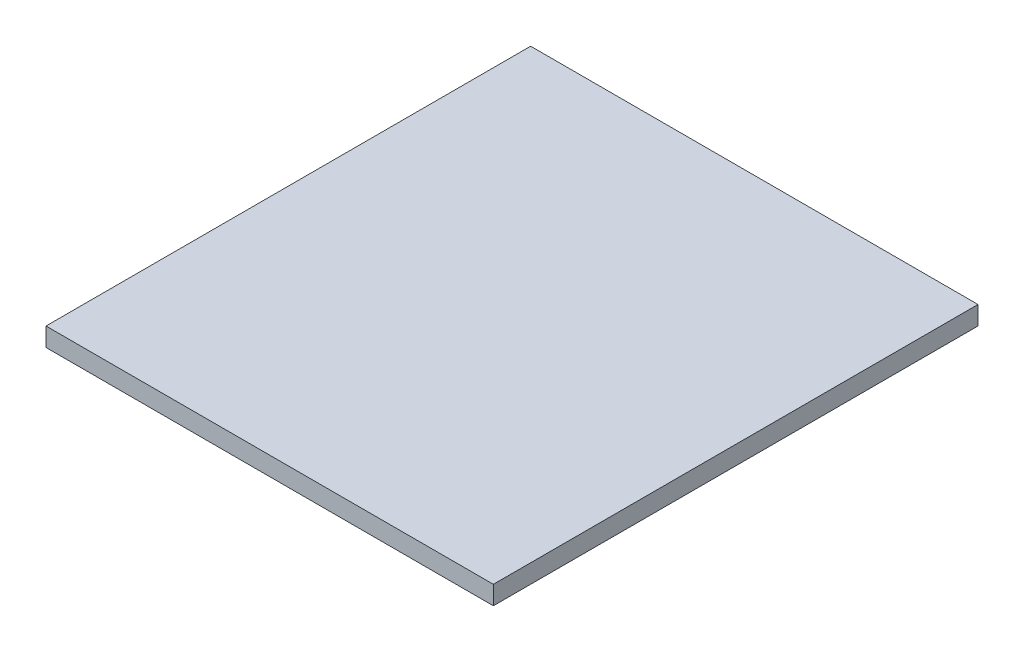
ISO-10303-21;
HEADER;
FILE_DESCRIPTION(('STEP AP214'),'2;1');
FILE_NAME('part.step','',(''),(''),'','','');
FILE_SCHEMA(('AUTOMOTIVE_DESIGN { 1 0 10303 214 1 1 1 1 }'));
ENDSEC;
DATA;
#1=APPLICATION_CONTEXT('core data for automotive mechanical design processes');
#2=APPLICATION_PROTOCOL_DEFINITION('international standard','automotive_design',2000,#1);
#3=PRODUCT_CONTEXT('',#1,'mechanical');
#4=PRODUCT('Part','Part','',(#3));
#5=PRODUCT_RELATED_PRODUCT_CATEGORY('part','',(#4));
#6=PRODUCT_DEFINITION_FORMATION('','',#4);
#7=PRODUCT_DEFINITION_CONTEXT('part definition',#1,'design');
#8=PRODUCT_DEFINITION('design','',#6,#7);
#9=PRODUCT_DEFINITION_SHAPE('','',#8);
#10=(LENGTH_UNIT() NAMED_UNIT(*) SI_UNIT(.MILLI.,.METRE.));
#11=(NAMED_UNIT(*) PLANE_ANGLE_UNIT() SI_UNIT($,.RADIAN.));
#12=(NAMED_UNIT(*) SI_UNIT($,.STERADIAN.) SOLID_ANGLE_UNIT());
#13=UNCERTAINTY_MEASURE_WITH_UNIT(LENGTH_MEASURE(1.E-05),#10,'distance_accuracy_value','');
#14=(GEOMETRIC_REPRESENTATION_CONTEXT(3) GLOBAL_UNCERTAINTY_ASSIGNED_CONTEXT((#13)) GLOBAL_UNIT_ASSIGNED_CONTEXT((#10,
#11,#12)) REPRESENTATION_CONTEXT('',''));
#15=CARTESIAN_POINT('',(0.,0.,0.));
#16=DIRECTION('',(0.,0.,1.));
#17=DIRECTION('',(1.,0.,0.));
#18=AXIS2_PLACEMENT_3D('',#15,#16,#17);
#19=CARTESIAN_POINT('',(114.3,9.525,-123.825));
#20=DIRECTION('',(-1.,0.,0.));
#21=DIRECTION('',(0.,0.,1.));
#22=AXIS2_PLACEMENT_3D('',#19,#20,#21);
#23=PLANE('',#22);
#24=DIRECTION('',(0.,0.,-1.));
#25=VECTOR('',#24,1.);
#26=CARTESIAN_POINT('',(114.3,0.,-123.825));
#27=LINE('',#26,#25);
#28=CARTESIAN_POINT('',(114.3,0.,123.825));
#29=VERTEX_POINT('',#28);
#30=CARTESIAN_POINT('',(114.3,0.,-123.825));
#31=VERTEX_POINT('',#30);
#32=EDGE_CURVE('E111',#29,#31,#27,.T.);
#33=ORIENTED_EDGE('',*,*,#32,.T.);
#34=DIRECTION('',(0.,-1.,0.));
#35=VECTOR('',#34,1.);
#36=CARTESIAN_POINT('',(114.3,9.525,-123.825));
#37=LINE('',#36,#35);
#38=CARTESIAN_POINT('',(114.3,9.525,-123.825));
#39=VERTEX_POINT('',#38);
#40=EDGE_CURVE('E11',#39,#31,#37,.T.);
#41=ORIENTED_EDGE('',*,*,#40,.F.);
#42=DIRECTION('',(0.,0.,-1.));
#43=VECTOR('',#42,1.);
#44=CARTESIAN_POINT('',(114.3,9.525,-123.825));
#45=LINE('',#44,#43);
#46=CARTESIAN_POINT('',(114.3,9.525,123.825));
#47=VERTEX_POINT('',#46);
#48=EDGE_CURVE('E95',#47,#39,#45,.T.);
#49=ORIENTED_EDGE('',*,*,#48,.F.);
#50=DIRECTION('',(0.,-1.,0.));
#51=VECTOR('',#50,1.);
#52=CARTESIAN_POINT('',(114.3,9.525,123.825));
#53=LINE('',#52,#51);
#54=EDGE_CURVE('E107',#47,#29,#53,.T.);
#55=ORIENTED_EDGE('',*,*,#54,.T.);
#56=EDGE_LOOP('',(#33,#41,#49,#55));
#57=FACE_BOUND('',#56,.T.);
#58=ADVANCED_FACE('F43',(#57),#23,.F.);
#59=CARTESIAN_POINT('',(-114.3,9.525,-123.825));
#60=DIRECTION('',(0.,0.,1.));
#61=DIRECTION('',(1.,0.,0.));
#62=AXIS2_PLACEMENT_3D('',#59,#60,#61);
#63=PLANE('',#62);
#64=DIRECTION('',(-1.,0.,0.));
#65=VECTOR('',#64,1.);
#66=CARTESIAN_POINT('',(-114.3,0.,-123.825));
#67=LINE('',#66,#65);
#68=CARTESIAN_POINT('',(-114.3,0.,-123.825));
#69=VERTEX_POINT('',#68);
#70=EDGE_CURVE('E100',#31,#69,#67,.T.);
#71=ORIENTED_EDGE('',*,*,#70,.T.);
#72=DIRECTION('',(0.,-1.,0.));
#73=VECTOR('',#72,1.);
#74=CARTESIAN_POINT('',(-114.3,9.525,-123.825));
#75=LINE('',#74,#73);
#76=CARTESIAN_POINT('',(-114.3,9.525,-123.825));
#77=VERTEX_POINT('',#76);
#78=EDGE_CURVE('E52',#77,#69,#75,.T.);
#79=ORIENTED_EDGE('',*,*,#78,.F.);
#80=DIRECTION('',(-1.,0.,0.));
#81=VECTOR('',#80,1.);
#82=CARTESIAN_POINT('',(-114.3,9.525,-123.825));
#83=LINE('',#82,#81);
#84=EDGE_CURVE('E90',#39,#77,#83,.T.);
#85=ORIENTED_EDGE('',*,*,#84,.F.);
#86=ORIENTED_EDGE('',*,*,#40,.T.);
#87=EDGE_LOOP('',(#71,#79,#85,#86));
#88=FACE_BOUND('',#87,.T.);
#89=ADVANCED_FACE('F99',(#88),#63,.F.);
#90=CARTESIAN_POINT('',(-114.3,9.525,-123.825));
#91=DIRECTION('',(1.,0.,0.));
#92=DIRECTION('',(0.,0.,-1.));
#93=AXIS2_PLACEMENT_3D('',#90,#91,#92);
#94=PLANE('',#93);
#95=DIRECTION('',(0.,0.,1.));
#96=VECTOR('',#95,1.);
#97=CARTESIAN_POINT('',(-114.3,0.,-123.825));
#98=LINE('',#97,#96);
#99=CARTESIAN_POINT('',(-114.3,0.,123.825));
#100=VERTEX_POINT('',#99);
#101=EDGE_CURVE('E77',#69,#100,#98,.T.);
#102=ORIENTED_EDGE('',*,*,#101,.T.);
#103=DIRECTION('',(0.,-1.,0.));
#104=VECTOR('',#103,1.);
#105=CARTESIAN_POINT('',(-114.3,9.525,123.825));
#106=LINE('',#105,#104);
#107=CARTESIAN_POINT('',(-114.3,9.525,123.825));
#108=VERTEX_POINT('',#107);
#109=EDGE_CURVE('E102',#108,#100,#106,.T.);
#110=ORIENTED_EDGE('',*,*,#109,.F.);
#111=DIRECTION('',(0.,0.,1.));
#112=VECTOR('',#111,1.);
#113=CARTESIAN_POINT('',(-114.3,9.525,-123.825));
#114=LINE('',#113,#112);
#115=EDGE_CURVE('E93',#77,#108,#114,.T.);
#116=ORIENTED_EDGE('',*,*,#115,.F.);
#117=ORIENTED_EDGE('',*,*,#78,.T.);
#118=EDGE_LOOP('',(#102,#110,#116,#117));
#119=FACE_BOUND('',#118,.T.);
#120=ADVANCED_FACE('F103',(#119),#94,.F.);
#121=CARTESIAN_POINT('',(-114.3,9.525,123.825));
#122=DIRECTION('',(0.,0.,-1.));
#123=DIRECTION('',(-1.,0.,0.));
#124=AXIS2_PLACEMENT_3D('',#121,#122,#123);
#125=PLANE('',#124);
#126=DIRECTION('',(1.,0.,0.));
#127=VECTOR('',#126,1.);
#128=CARTESIAN_POINT('',(-114.3,0.,123.825));
#129=LINE('',#128,#127);
#130=EDGE_CURVE('E83',#100,#29,#129,.T.);
#131=ORIENTED_EDGE('',*,*,#130,.T.);
#132=ORIENTED_EDGE('',*,*,#54,.F.);
#133=DIRECTION('',(1.,0.,0.));
#134=VECTOR('',#133,1.);
#135=CARTESIAN_POINT('',(-114.3,9.525,123.825));
#136=LINE('',#135,#134);
#137=EDGE_CURVE('E60',#108,#47,#136,.T.);
#138=ORIENTED_EDGE('',*,*,#137,.F.);
#139=ORIENTED_EDGE('',*,*,#109,.T.);
#140=EDGE_LOOP('',(#131,#132,#138,#139));
#141=FACE_BOUND('',#140,.T.);
#142=ADVANCED_FACE('F124',(#141),#125,.F.);
#143=CARTESIAN_POINT('',(0.,9.525,0.));
#144=DIRECTION('',(0.,1.,0.));
#145=DIRECTION('',(0.,0.,1.));
#146=AXIS2_PLACEMENT_3D('',#143,#144,#145);
#147=PLANE('',#146);
#148=ORIENTED_EDGE('',*,*,#48,.T.);
#149=ORIENTED_EDGE('',*,*,#84,.T.);
#150=ORIENTED_EDGE('',*,*,#115,.T.);
#151=ORIENTED_EDGE('',*,*,#137,.T.);
#152=EDGE_LOOP('',(#148,#149,#150,#151));
#153=FACE_BOUND('',#152,.T.);
#154=ADVANCED_FACE('F91',(#153),#147,.T.);
#155=CARTESIAN_POINT('',(0.,0.,0.));
#156=DIRECTION('',(0.,1.,0.));
#157=DIRECTION('',(0.,0.,1.));
#158=AXIS2_PLACEMENT_3D('',#155,#156,#157);
#159=PLANE('',#158);
#160=ORIENTED_EDGE('',*,*,#32,.F.);
#161=ORIENTED_EDGE('',*,*,#130,.F.);
#162=ORIENTED_EDGE('',*,*,#101,.F.);
#163=ORIENTED_EDGE('',*,*,#70,.F.);
#164=EDGE_LOOP('',(#160,#161,#162,#163));
#165=FACE_BOUND('',#164,.T.);
#166=ADVANCED_FACE('F127',(#165),#159,.F.);
#167=CLOSED_SHELL('',(#58,#89,#120,#142,#154,#166));
#168=MANIFOLD_SOLID_BREP('B2',#167);
#169=ADVANCED_BREP_SHAPE_REPRESENTATION('',(#18,#168),#14);
#170=SHAPE_DEFINITION_REPRESENTATION(#9,#169);
ENDSEC;
END-ISO-10303-21;
